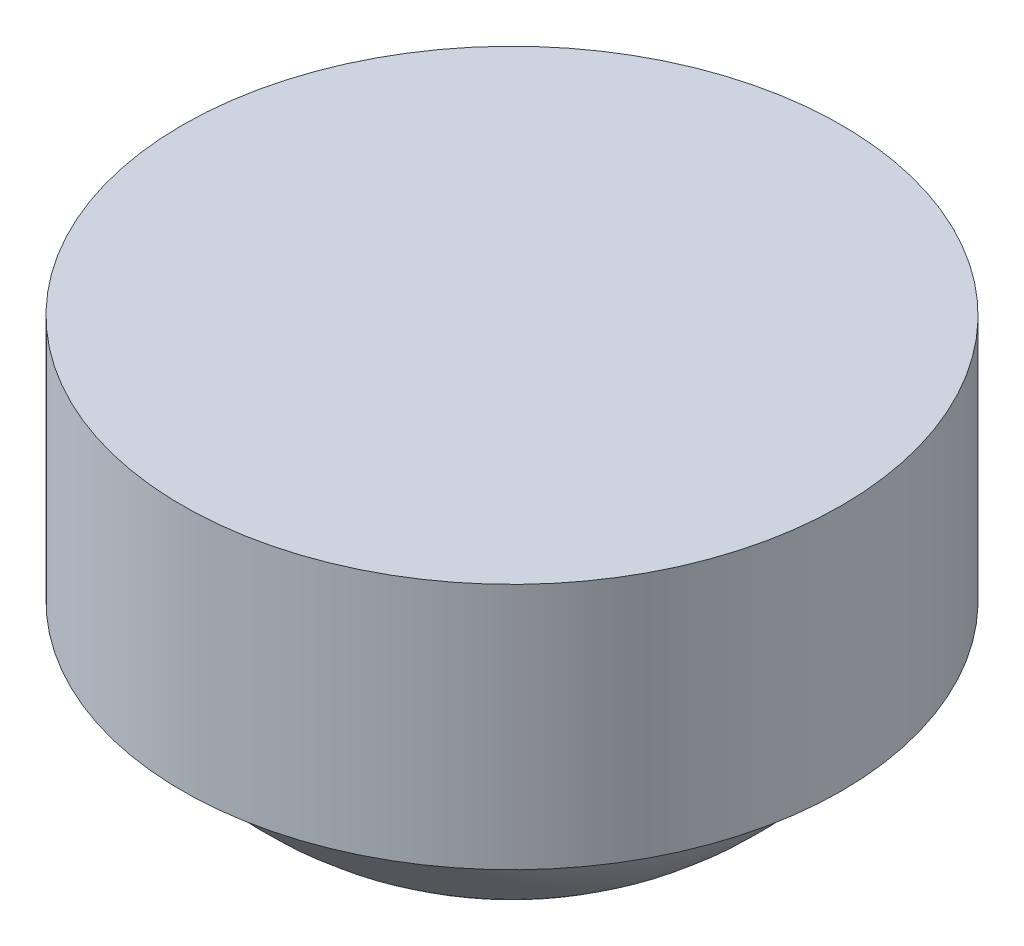
ISO-10303-21;
HEADER;
FILE_DESCRIPTION(('STEP AP214'),'2;1');
FILE_NAME('part.step','',(''),(''),'','','');
FILE_SCHEMA(('AUTOMOTIVE_DESIGN { 1 0 10303 214 1 1 1 1 }'));
ENDSEC;
DATA;
#1=APPLICATION_CONTEXT('core data for automotive mechanical design processes');
#2=APPLICATION_PROTOCOL_DEFINITION('international standard','automotive_design',2000,#1);
#3=PRODUCT_CONTEXT('',#1,'mechanical');
#4=PRODUCT('Part','Part','',(#3));
#5=PRODUCT_RELATED_PRODUCT_CATEGORY('part','',(#4));
#6=PRODUCT_DEFINITION_FORMATION('','',#4);
#7=PRODUCT_DEFINITION_CONTEXT('part definition',#1,'design');
#8=PRODUCT_DEFINITION('design','',#6,#7);
#9=PRODUCT_DEFINITION_SHAPE('','',#8);
#10=(LENGTH_UNIT() NAMED_UNIT(*) SI_UNIT(.MILLI.,.METRE.));
#11=(NAMED_UNIT(*) PLANE_ANGLE_UNIT() SI_UNIT($,.RADIAN.));
#12=(NAMED_UNIT(*) SI_UNIT($,.STERADIAN.) SOLID_ANGLE_UNIT());
#13=UNCERTAINTY_MEASURE_WITH_UNIT(LENGTH_MEASURE(1.E-05),#10,'distance_accuracy_value','');
#14=(GEOMETRIC_REPRESENTATION_CONTEXT(3) GLOBAL_UNCERTAINTY_ASSIGNED_CONTEXT((#13)) GLOBAL_UNIT_ASSIGNED_CONTEXT((#10,
#11,#12)) REPRESENTATION_CONTEXT('',''));
#15=CARTESIAN_POINT('',(0.,0.,0.));
#16=DIRECTION('',(0.,0.,1.));
#17=DIRECTION('',(1.,0.,0.));
#18=AXIS2_PLACEMENT_3D('',#15,#16,#17);
#19=CARTESIAN_POINT('',(4.12780920555633E-13,-67.0000000000005,0.));
#20=DIRECTION('',(0.,-1.,0.));
#21=DIRECTION('',(1.,0.,0.));
#22=AXIS2_PLACEMENT_3D('',#19,#20,#21);
#23=CYLINDRICAL_SURFACE('',#22,20.);
#24=CARTESIAN_POINT('',(4.12780920555633E-13,-67.0000000000004,0.));
#25=DIRECTION('',(0.,-1.,0.));
#26=DIRECTION('',(1.,0.,0.));
#27=AXIS2_PLACEMENT_3D('',#24,#25,#26);
#28=CIRCLE('',#27,20.);
#29=CARTESIAN_POINT('',(20.0000000000004,-67.0000000000005,0.));
#30=VERTEX_POINT('',#29);
#31=EDGE_CURVE('E10',#30,#30,#28,.T.);
#32=ORIENTED_EDGE('',*,*,#31,.T.);
#33=EDGE_LOOP('',(#32));
#34=FACE_BOUND('',#33,.T.);
#35=CARTESIAN_POINT('',(3.71527343767224E-13,-82.0000000000004,0.));
#36=DIRECTION('',(0.,-1.,0.));
#37=DIRECTION('',(1.,0.,0.));
#38=AXIS2_PLACEMENT_3D('',#35,#36,#37);
#39=CIRCLE('',#38,20.);
#40=CARTESIAN_POINT('',(20.0000000000004,-82.0000000000005,0.));
#41=VERTEX_POINT('',#40);
#42=EDGE_CURVE('E45',#41,#41,#39,.T.);
#43=ORIENTED_EDGE('',*,*,#42,.F.);
#44=EDGE_LOOP('',(#43));
#45=FACE_BOUND('',#44,.T.);
#46=ADVANCED_FACE('F35',(#34,#45),#23,.T.);
#47=CARTESIAN_POINT('',(20.0000000000004,-67.0000000000005,0.));
#48=DIRECTION('',(0.,1.,0.));
#49=DIRECTION('',(-1.,0.,0.));
#50=AXIS2_PLACEMENT_3D('',#47,#48,#49);
#51=PLANE('',#50);
#52=ORIENTED_EDGE('',*,*,#31,.F.);
#53=EDGE_LOOP('',(#52));
#54=FACE_BOUND('',#53,.T.);
#55=ADVANCED_FACE('F56',(#54),#51,.T.);
#56=CARTESIAN_POINT('',(4.03954647509863E-13,-72.0000000000005,0.));
#57=DIRECTION('',(0.,-1.,0.));
#58=DIRECTION('',(-1.,0.,0.));
#59=AXIS2_PLACEMENT_3D('',#56,#57,#58);
#60=SPHERICAL_SURFACE('',#59,21.);
#61=CARTESIAN_POINT('',(3.71527343767224E-13,-82.0000000000004,0.));
#62=DIRECTION('',(0.,-1.,0.));
#63=DIRECTION('',(1.,0.,0.));
#64=AXIS2_PLACEMENT_3D('',#61,#62,#63);
#65=CIRCLE('',#64,18.4661853126194);
#66=CARTESIAN_POINT('',(18.4661853126198,-82.0000000000005,0.));
#67=VERTEX_POINT('',#66);
#68=EDGE_CURVE('E41',#67,#67,#65,.T.);
#69=ORIENTED_EDGE('',*,*,#68,.T.);
#70=EDGE_LOOP('',(#69));
#71=FACE_BOUND('',#70,.T.);
#72=ADVANCED_FACE('F60',(#71),#60,.T.);
#73=CARTESIAN_POINT('',(18.4661853126198,-82.0000000000005,0.));
#74=DIRECTION('',(0.,-1.,0.));
#75=DIRECTION('',(1.,0.,0.));
#76=AXIS2_PLACEMENT_3D('',#73,#74,#75);
#77=PLANE('',#76);
#78=ORIENTED_EDGE('',*,*,#42,.T.);
#79=EDGE_LOOP('',(#78));
#80=FACE_BOUND('',#79,.T.);
#81=ORIENTED_EDGE('',*,*,#68,.F.);
#82=EDGE_LOOP('',(#81));
#83=FACE_BOUND('',#82,.T.);
#84=ADVANCED_FACE('F52',(#80,#83),#77,.T.);
#85=CLOSED_SHELL('',(#46,#55,#72,#84));
#86=MANIFOLD_SOLID_BREP('B2',#85);
#87=ADVANCED_BREP_SHAPE_REPRESENTATION('',(#18,#86),#14);
#88=SHAPE_DEFINITION_REPRESENTATION(#9,#87);
ENDSEC;
END-ISO-10303-21;
